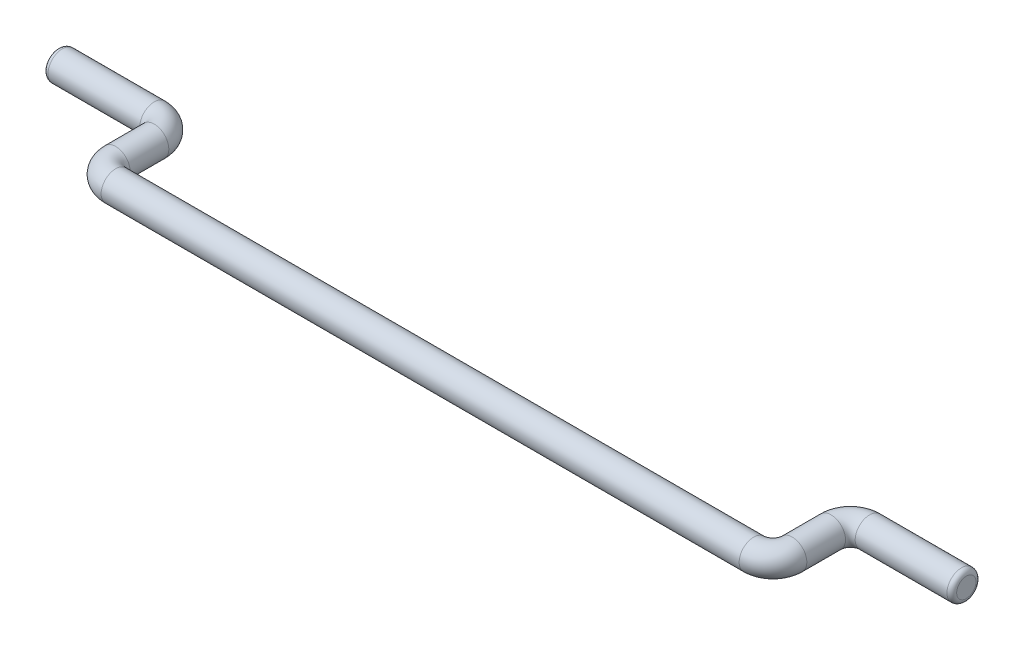
ISO-10303-21;
HEADER;
FILE_DESCRIPTION(('STEP AP214'),'2;1');
FILE_NAME('part.step','',(''),(''),'','','');
FILE_SCHEMA(('AUTOMOTIVE_DESIGN { 1 0 10303 214 1 1 1 1 }'));
ENDSEC;
DATA;
#1=APPLICATION_CONTEXT('core data for automotive mechanical design processes');
#2=APPLICATION_PROTOCOL_DEFINITION('international standard','automotive_design',2000,#1);
#3=PRODUCT_CONTEXT('',#1,'mechanical');
#4=PRODUCT('Part','Part','',(#3));
#5=PRODUCT_RELATED_PRODUCT_CATEGORY('part','',(#4));
#6=PRODUCT_DEFINITION_FORMATION('','',#4);
#7=PRODUCT_DEFINITION_CONTEXT('part definition',#1,'design');
#8=PRODUCT_DEFINITION('design','',#6,#7);
#9=PRODUCT_DEFINITION_SHAPE('','',#8);
#10=(LENGTH_UNIT() NAMED_UNIT(*) SI_UNIT(.MILLI.,.METRE.));
#11=(NAMED_UNIT(*) PLANE_ANGLE_UNIT() SI_UNIT($,.RADIAN.));
#12=(NAMED_UNIT(*) SI_UNIT($,.STERADIAN.) SOLID_ANGLE_UNIT());
#13=UNCERTAINTY_MEASURE_WITH_UNIT(LENGTH_MEASURE(1.E-05),#10,'distance_accuracy_value','');
#14=(GEOMETRIC_REPRESENTATION_CONTEXT(3) GLOBAL_UNCERTAINTY_ASSIGNED_CONTEXT((#13)) GLOBAL_UNIT_ASSIGNED_CONTEXT((#10,
#11,#12)) REPRESENTATION_CONTEXT('',''));
#15=CARTESIAN_POINT('',(0.,0.,0.));
#16=DIRECTION('',(0.,0.,1.));
#17=DIRECTION('',(1.,0.,0.));
#18=AXIS2_PLACEMENT_3D('',#15,#16,#17);
#19=CARTESIAN_POINT('',(-6.,0.,0.));
#20=DIRECTION('',(1.,0.,0.));
#21=DIRECTION('',(0.,0.,-1.));
#22=AXIS2_PLACEMENT_3D('',#19,#20,#21);
#23=PLANE('',#22);
#24=CARTESIAN_POINT('',(-6.,0.,0.));
#25=DIRECTION('',(1.,0.,0.));
#26=DIRECTION('',(0.,0.,-1.));
#27=AXIS2_PLACEMENT_3D('',#24,#25,#26);
#28=CIRCLE('',#27,0.5);
#29=CARTESIAN_POINT('',(-6.,0.,-0.5));
#30=VERTEX_POINT('',#29);
#31=EDGE_CURVE('E10',#30,#30,#28,.F.);
#32=ORIENTED_EDGE('',*,*,#31,.T.);
#33=EDGE_LOOP('',(#32));
#34=FACE_BOUND('',#33,.T.);
#35=ADVANCED_FACE('F45',(#34),#23,.F.);
#36=CARTESIAN_POINT('',(41.,0.,0.));
#37=DIRECTION('',(1.,0.,0.));
#38=DIRECTION('',(0.,0.,-1.));
#39=AXIS2_PLACEMENT_3D('',#36,#37,#38);
#40=PLANE('',#39);
#41=CARTESIAN_POINT('',(41.,0.,0.));
#42=DIRECTION('',(1.,0.,0.));
#43=DIRECTION('',(0.,0.,-1.));
#44=AXIS2_PLACEMENT_3D('',#41,#42,#43);
#45=CIRCLE('',#44,0.5);
#46=CARTESIAN_POINT('',(41.,0.,-0.5));
#47=VERTEX_POINT('',#46);
#48=EDGE_CURVE('E63',#47,#47,#45,.T.);
#49=ORIENTED_EDGE('',*,*,#48,.T.);
#50=EDGE_LOOP('',(#49));
#51=FACE_BOUND('',#50,.T.);
#52=ADVANCED_FACE('F106',(#51),#40,.T.);
#53=CARTESIAN_POINT('',(-6.,0.,0.));
#54=DIRECTION('',(1.,0.,0.));
#55=DIRECTION('',(0.,0.,-1.));
#56=AXIS2_PLACEMENT_3D('',#53,#54,#55);
#57=CYLINDRICAL_SURFACE('',#56,0.75);
#58=CARTESIAN_POINT('',(-5.75,0.,0.));
#59=DIRECTION('',(1.,0.,0.));
#60=DIRECTION('',(0.,0.,-1.));
#61=AXIS2_PLACEMENT_3D('',#58,#59,#60);
#62=CIRCLE('',#61,0.75);
#63=CARTESIAN_POINT('',(-5.75,0.,-0.75));
#64=VERTEX_POINT('',#63);
#65=EDGE_CURVE('E53',#64,#64,#62,.T.);
#66=ORIENTED_EDGE('',*,*,#65,.T.);
#67=EDGE_LOOP('',(#66));
#68=FACE_BOUND('',#67,.T.);
#69=CARTESIAN_POINT('',(-1.00000000000001,0.,0.));
#70=DIRECTION('',(1.,0.,0.));
#71=DIRECTION('',(0.,0.,-1.));
#72=AXIS2_PLACEMENT_3D('',#69,#70,#71);
#73=CIRCLE('',#72,0.75);
#74=CARTESIAN_POINT('',(-1.00000000000001,0.,-0.750000000000043));
#75=VERTEX_POINT('',#74);
#76=EDGE_CURVE('E97',#75,#75,#73,.T.);
#77=ORIENTED_EDGE('',*,*,#76,.F.);
#78=EDGE_LOOP('',(#77));
#79=FACE_BOUND('',#78,.T.);
#80=ADVANCED_FACE('F104',(#68,#79),#57,.T.);
#81=CARTESIAN_POINT('',(-1.,0.,1.));
#82=DIRECTION('',(0.,-1.,0.));
#83=DIRECTION('',(0.,0.,-1.));
#84=AXIS2_PLACEMENT_3D('',#81,#82,#83);
#85=TOROIDAL_SURFACE('',#84,1.00000000000004,0.75);
#86=CARTESIAN_POINT('',(0.,0.,1.00000000000001));
#87=DIRECTION('',(0.,0.,1.));
#88=DIRECTION('',(1.,0.,0.));
#89=AXIS2_PLACEMENT_3D('',#86,#87,#88);
#90=CIRCLE('',#89,0.75);
#91=CARTESIAN_POINT('',(0.750000000000043,0.,1.00000000000001));
#92=VERTEX_POINT('',#91);
#93=EDGE_CURVE('E93',#92,#92,#90,.T.);
#94=CARTESIAN_POINT('',(-1.,0.,1.));
#95=DIRECTION('',(0.,-1.,0.));
#96=DIRECTION('',(0.,0.,-1.));
#97=AXIS2_PLACEMENT_3D('',#94,#95,#96);
#98=CIRCLE('',#97,1.75000000000004);
#99=EDGE_CURVE('',#75,#92,#98,.T.);
#100=ORIENTED_EDGE('',*,*,#76,.T.);
#101=ORIENTED_EDGE('',*,*,#93,.F.);
#102=ORIENTED_EDGE('',*,*,#99,.T.);
#103=ORIENTED_EDGE('',*,*,#99,.F.);
#104=EDGE_LOOP('',(#100,#102,#101,#103));
#105=FACE_BOUND('',#104,.T.);
#106=ADVANCED_FACE('F102',(#105),#85,.T.);
#107=CARTESIAN_POINT('',(0.,0.,1.00000000000001));
#108=DIRECTION('',(0.,0.,1.));
#109=DIRECTION('',(1.,0.,0.));
#110=AXIS2_PLACEMENT_3D('',#107,#108,#109);
#111=CYLINDRICAL_SURFACE('',#110,0.75);
#112=CARTESIAN_POINT('',(0.,0.,2.99999999999999));
#113=DIRECTION('',(0.,0.,1.));
#114=DIRECTION('',(1.,0.,0.));
#115=AXIS2_PLACEMENT_3D('',#112,#113,#114);
#116=CIRCLE('',#115,0.75);
#117=CARTESIAN_POINT('',(-0.75,0.,2.99999999999999));
#118=VERTEX_POINT('',#117);
#119=EDGE_CURVE('E89',#118,#118,#116,.T.);
#120=ORIENTED_EDGE('',*,*,#119,.F.);
#121=EDGE_LOOP('',(#120));
#122=FACE_BOUND('',#121,.T.);
#123=ORIENTED_EDGE('',*,*,#93,.T.);
#124=EDGE_LOOP('',(#123));
#125=FACE_BOUND('',#124,.T.);
#126=ADVANCED_FACE('F113',(#122,#125),#111,.T.);
#127=CARTESIAN_POINT('',(1.,0.,3.));
#128=DIRECTION('',(0.,1.,0.));
#129=DIRECTION('',(0.,0.,1.));
#130=AXIS2_PLACEMENT_3D('',#127,#128,#129);
#131=TOROIDAL_SURFACE('',#130,1.,0.75);
#132=CARTESIAN_POINT('',(1.,0.,4.));
#133=DIRECTION('',(1.,0.,0.));
#134=DIRECTION('',(0.,0.,-1.));
#135=AXIS2_PLACEMENT_3D('',#132,#133,#134);
#136=CIRCLE('',#135,0.75);
#137=CARTESIAN_POINT('',(1.,0.,4.75));
#138=VERTEX_POINT('',#137);
#139=EDGE_CURVE('E85',#138,#138,#136,.T.);
#140=CARTESIAN_POINT('',(1.,0.,3.));
#141=DIRECTION('',(0.,1.,0.));
#142=DIRECTION('',(0.,0.,1.));
#143=AXIS2_PLACEMENT_3D('',#140,#141,#142);
#144=CIRCLE('',#143,1.75);
#145=EDGE_CURVE('',#118,#138,#144,.T.);
#146=ORIENTED_EDGE('',*,*,#119,.T.);
#147=ORIENTED_EDGE('',*,*,#139,.F.);
#148=ORIENTED_EDGE('',*,*,#145,.T.);
#149=ORIENTED_EDGE('',*,*,#145,.F.);
#150=EDGE_LOOP('',(#146,#148,#147,#149));
#151=FACE_BOUND('',#150,.T.);
#152=ADVANCED_FACE('F165',(#151),#131,.T.);
#153=CARTESIAN_POINT('',(1.,0.,4.));
#154=DIRECTION('',(1.,0.,0.));
#155=DIRECTION('',(0.,0.,-1.));
#156=AXIS2_PLACEMENT_3D('',#153,#154,#155);
#157=CYLINDRICAL_SURFACE('',#156,0.75);
#158=CARTESIAN_POINT('',(34.,0.,4.));
#159=DIRECTION('',(1.,0.,0.));
#160=DIRECTION('',(0.,0.,-1.));
#161=AXIS2_PLACEMENT_3D('',#158,#159,#160);
#162=CIRCLE('',#161,0.75);
#163=CARTESIAN_POINT('',(34.,0.,4.75));
#164=VERTEX_POINT('',#163);
#165=EDGE_CURVE('E81',#164,#164,#162,.T.);
#166=ORIENTED_EDGE('',*,*,#165,.F.);
#167=EDGE_LOOP('',(#166));
#168=FACE_BOUND('',#167,.T.);
#169=ORIENTED_EDGE('',*,*,#139,.T.);
#170=EDGE_LOOP('',(#169));
#171=FACE_BOUND('',#170,.T.);
#172=ADVANCED_FACE('F175',(#168,#171),#157,.T.);
#173=CARTESIAN_POINT('',(34.,0.,3.));
#174=DIRECTION('',(0.,1.,0.));
#175=DIRECTION('',(0.,0.,1.));
#176=AXIS2_PLACEMENT_3D('',#173,#174,#175);
#177=TOROIDAL_SURFACE('',#176,1.,0.75);
#178=CARTESIAN_POINT('',(35.,0.,3.));
#179=DIRECTION('',(0.,0.,-1.));
#180=DIRECTION('',(-1.,0.,0.));
#181=AXIS2_PLACEMENT_3D('',#178,#179,#180);
#182=CIRCLE('',#181,0.75);
#183=CARTESIAN_POINT('',(35.75,0.,3.));
#184=VERTEX_POINT('',#183);
#185=EDGE_CURVE('E77',#184,#184,#182,.T.);
#186=CARTESIAN_POINT('',(34.,0.,3.));
#187=DIRECTION('',(0.,1.,0.));
#188=DIRECTION('',(0.,0.,1.));
#189=AXIS2_PLACEMENT_3D('',#186,#187,#188);
#190=CIRCLE('',#189,1.75);
#191=EDGE_CURVE('',#164,#184,#190,.T.);
#192=ORIENTED_EDGE('',*,*,#165,.T.);
#193=ORIENTED_EDGE('',*,*,#185,.F.);
#194=ORIENTED_EDGE('',*,*,#191,.T.);
#195=ORIENTED_EDGE('',*,*,#191,.F.);
#196=EDGE_LOOP('',(#192,#194,#193,#195));
#197=FACE_BOUND('',#196,.T.);
#198=ADVANCED_FACE('F185',(#197),#177,.T.);
#199=CARTESIAN_POINT('',(35.,0.,3.));
#200=DIRECTION('',(0.,0.,-1.));
#201=DIRECTION('',(-1.,0.,0.));
#202=AXIS2_PLACEMENT_3D('',#199,#200,#201);
#203=CYLINDRICAL_SURFACE('',#202,0.75);
#204=CARTESIAN_POINT('',(35.,0.,0.999999999999999));
#205=DIRECTION('',(0.,0.,-1.));
#206=DIRECTION('',(-1.,0.,0.));
#207=AXIS2_PLACEMENT_3D('',#204,#205,#206);
#208=CIRCLE('',#207,0.75);
#209=CARTESIAN_POINT('',(34.25,0.,0.999999999999999));
#210=VERTEX_POINT('',#209);
#211=EDGE_CURVE('E73',#210,#210,#208,.T.);
#212=ORIENTED_EDGE('',*,*,#211,.F.);
#213=EDGE_LOOP('',(#212));
#214=FACE_BOUND('',#213,.T.);
#215=ORIENTED_EDGE('',*,*,#185,.T.);
#216=EDGE_LOOP('',(#215));
#217=FACE_BOUND('',#216,.T.);
#218=ADVANCED_FACE('F128',(#214,#217),#203,.T.);
#219=CARTESIAN_POINT('',(36.,0.,0.999999999999999));
#220=DIRECTION('',(0.,-1.,0.));
#221=DIRECTION('',(0.,0.,-1.));
#222=AXIS2_PLACEMENT_3D('',#219,#220,#221);
#223=TOROIDAL_SURFACE('',#222,1.,0.75);
#224=CARTESIAN_POINT('',(36.,0.,0.));
#225=DIRECTION('',(1.,0.,0.));
#226=DIRECTION('',(0.,0.,-1.));
#227=AXIS2_PLACEMENT_3D('',#224,#225,#226);
#228=CIRCLE('',#227,0.75);
#229=CARTESIAN_POINT('',(36.,0.,-0.750000000000002));
#230=VERTEX_POINT('',#229);
#231=EDGE_CURVE('E69',#230,#230,#228,.T.);
#232=CARTESIAN_POINT('',(36.,0.,0.999999999999999));
#233=DIRECTION('',(0.,-1.,0.));
#234=DIRECTION('',(0.,0.,-1.));
#235=AXIS2_PLACEMENT_3D('',#232,#233,#234);
#236=CIRCLE('',#235,1.75);
#237=EDGE_CURVE('',#210,#230,#236,.T.);
#238=ORIENTED_EDGE('',*,*,#211,.T.);
#239=ORIENTED_EDGE('',*,*,#231,.F.);
#240=ORIENTED_EDGE('',*,*,#237,.T.);
#241=ORIENTED_EDGE('',*,*,#237,.F.);
#242=EDGE_LOOP('',(#238,#240,#239,#241));
#243=FACE_BOUND('',#242,.T.);
#244=ADVANCED_FACE('F120',(#243),#223,.T.);
#245=CARTESIAN_POINT('',(36.,0.,0.));
#246=DIRECTION('',(1.,0.,0.));
#247=DIRECTION('',(0.,0.,-1.));
#248=AXIS2_PLACEMENT_3D('',#245,#246,#247);
#249=CYLINDRICAL_SURFACE('',#248,0.75);
#250=CARTESIAN_POINT('',(40.75,0.,0.));
#251=DIRECTION('',(1.,0.,0.));
#252=DIRECTION('',(0.,0.,-1.));
#253=AXIS2_PLACEMENT_3D('',#250,#251,#252);
#254=CIRCLE('',#253,0.75);
#255=CARTESIAN_POINT('',(40.75,0.,-0.75));
#256=VERTEX_POINT('',#255);
#257=EDGE_CURVE('E58',#256,#256,#254,.F.);
#258=ORIENTED_EDGE('',*,*,#257,.T.);
#259=EDGE_LOOP('',(#258));
#260=FACE_BOUND('',#259,.T.);
#261=ORIENTED_EDGE('',*,*,#231,.T.);
#262=EDGE_LOOP('',(#261));
#263=FACE_BOUND('',#262,.T.);
#264=ADVANCED_FACE('F118',(#260,#263),#249,.T.);
#265=CARTESIAN_POINT('',(40.75,0.,0.));
#266=DIRECTION('',(1.,0.,0.));
#267=DIRECTION('',(0.,0.,-1.));
#268=AXIS2_PLACEMENT_3D('',#265,#266,#267);
#269=TOROIDAL_SURFACE('',#268,0.5,0.25);
#270=ORIENTED_EDGE('',*,*,#257,.F.);
#271=EDGE_LOOP('',(#270));
#272=FACE_BOUND('',#271,.T.);
#273=ORIENTED_EDGE('',*,*,#48,.F.);
#274=EDGE_LOOP('',(#273));
#275=FACE_BOUND('',#274,.T.);
#276=ADVANCED_FACE('F119',(#272,#275),#269,.T.);
#277=CARTESIAN_POINT('',(-5.75,0.,0.));
#278=DIRECTION('',(1.,0.,0.));
#279=DIRECTION('',(0.,0.,-1.));
#280=AXIS2_PLACEMENT_3D('',#277,#278,#279);
#281=TOROIDAL_SURFACE('',#280,0.5,0.25);
#282=ORIENTED_EDGE('',*,*,#31,.F.);
#283=EDGE_LOOP('',(#282));
#284=FACE_BOUND('',#283,.T.);
#285=ORIENTED_EDGE('',*,*,#65,.F.);
#286=EDGE_LOOP('',(#285));
#287=FACE_BOUND('',#286,.T.);
#288=ADVANCED_FACE('F47',(#284,#287),#281,.T.);
#289=CLOSED_SHELL('',(#35,#52,#80,#106,#126,#152,#172,#198,#218,#244,#264,#276,#288));
#290=MANIFOLD_SOLID_BREP('B2',#289);
#291=ADVANCED_BREP_SHAPE_REPRESENTATION('',(#18,#290),#14);
#292=SHAPE_DEFINITION_REPRESENTATION(#9,#291);
ENDSEC;
END-ISO-10303-21;
